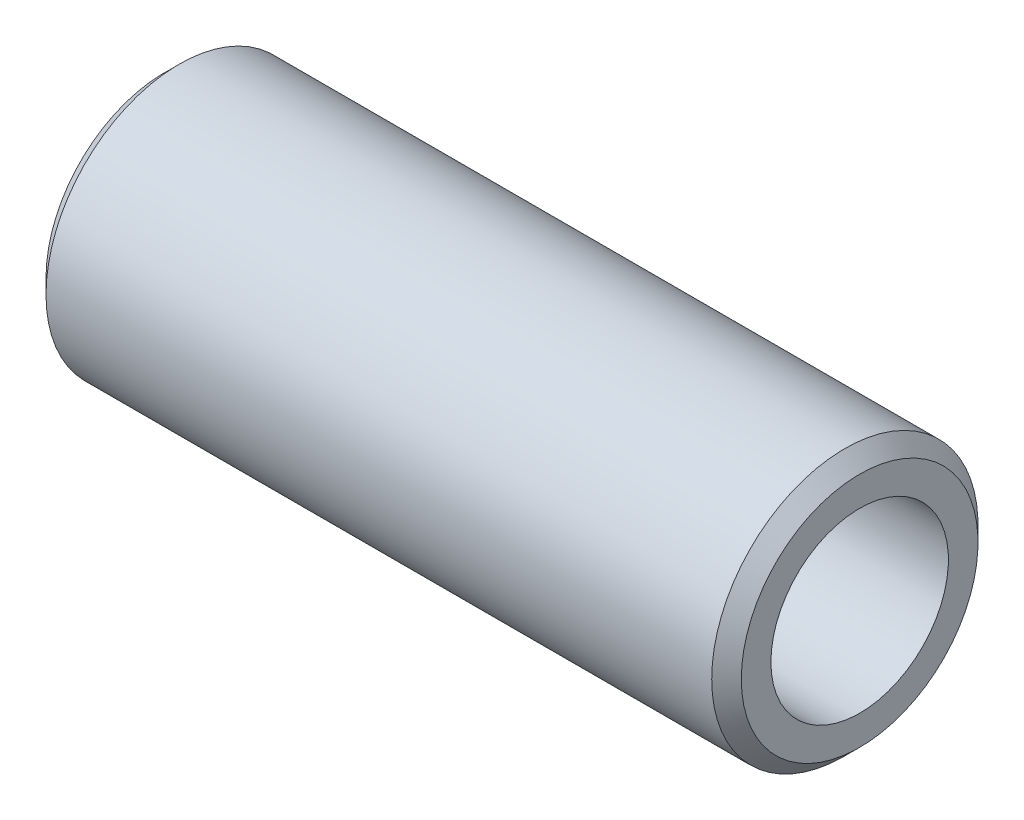
ISO-10303-21;
HEADER;
FILE_DESCRIPTION(('STEP AP214'),'2;1');
FILE_NAME('part.step','',(''),(''),'','','');
FILE_SCHEMA(('AUTOMOTIVE_DESIGN { 1 0 10303 214 1 1 1 1 }'));
ENDSEC;
DATA;
#1=APPLICATION_CONTEXT('core data for automotive mechanical design processes');
#2=APPLICATION_PROTOCOL_DEFINITION('international standard','automotive_design',2000,#1);
#3=PRODUCT_CONTEXT('',#1,'mechanical');
#4=PRODUCT('Part','Part','',(#3));
#5=PRODUCT_RELATED_PRODUCT_CATEGORY('part','',(#4));
#6=PRODUCT_DEFINITION_FORMATION('','',#4);
#7=PRODUCT_DEFINITION_CONTEXT('part definition',#1,'design');
#8=PRODUCT_DEFINITION('design','',#6,#7);
#9=PRODUCT_DEFINITION_SHAPE('','',#8);
#10=(LENGTH_UNIT() NAMED_UNIT(*) SI_UNIT(.MILLI.,.METRE.));
#11=(NAMED_UNIT(*) PLANE_ANGLE_UNIT() SI_UNIT($,.RADIAN.));
#12=(NAMED_UNIT(*) SI_UNIT($,.STERADIAN.) SOLID_ANGLE_UNIT());
#13=UNCERTAINTY_MEASURE_WITH_UNIT(LENGTH_MEASURE(1.E-05),#10,'distance_accuracy_value','');
#14=(GEOMETRIC_REPRESENTATION_CONTEXT(3) GLOBAL_UNCERTAINTY_ASSIGNED_CONTEXT((#13)) GLOBAL_UNIT_ASSIGNED_CONTEXT((#10,
#11,#12)) REPRESENTATION_CONTEXT('',''));
#15=CARTESIAN_POINT('',(0.,0.,0.));
#16=DIRECTION('',(0.,0.,1.));
#17=DIRECTION('',(1.,0.,0.));
#18=AXIS2_PLACEMENT_3D('',#15,#16,#17);
#19=CARTESIAN_POINT('',(0.5,0.,0.));
#20=DIRECTION('',(1.,0.,0.));
#21=DIRECTION('',(0.,0.,-1.));
#22=AXIS2_PLACEMENT_3D('',#19,#20,#21);
#23=CONICAL_SURFACE('',#22,4.5,0.785398163397448);
#24=CARTESIAN_POINT('',(0.,0.,0.));
#25=DIRECTION('',(-1.,0.,0.));
#26=DIRECTION('',(0.,0.,1.));
#27=AXIS2_PLACEMENT_3D('',#24,#25,#26);
#28=CIRCLE('',#27,4.);
#29=CARTESIAN_POINT('',(0.,0.,4.));
#30=VERTEX_POINT('',#29);
#31=EDGE_CURVE('E37',#30,#30,#28,.T.);
#32=ORIENTED_EDGE('',*,*,#31,.F.);
#33=EDGE_LOOP('',(#32));
#34=FACE_BOUND('',#33,.T.);
#35=CARTESIAN_POINT('',(0.5,0.,0.));
#36=DIRECTION('',(-1.,0.,0.));
#37=DIRECTION('',(0.,0.,1.));
#38=AXIS2_PLACEMENT_3D('',#35,#36,#37);
#39=CIRCLE('',#38,4.5);
#40=CARTESIAN_POINT('',(0.5,0.,4.5));
#41=VERTEX_POINT('',#40);
#42=EDGE_CURVE('E10',#41,#41,#39,.T.);
#43=ORIENTED_EDGE('',*,*,#42,.T.);
#44=EDGE_LOOP('',(#43));
#45=FACE_BOUND('',#44,.T.);
#46=ADVANCED_FACE('F15',(#34,#45),#23,.T.);
#47=CARTESIAN_POINT('',(23.5,0.,0.));
#48=DIRECTION('',(-1.,0.,0.));
#49=DIRECTION('',(0.,0.,1.));
#50=AXIS2_PLACEMENT_3D('',#47,#48,#49);
#51=CYLINDRICAL_SURFACE('',#50,4.5);
#52=ORIENTED_EDGE('',*,*,#42,.F.);
#53=EDGE_LOOP('',(#52));
#54=FACE_BOUND('',#53,.T.);
#55=CARTESIAN_POINT('',(23.,0.,0.));
#56=DIRECTION('',(-1.,0.,0.));
#57=DIRECTION('',(0.,0.,1.));
#58=AXIS2_PLACEMENT_3D('',#55,#56,#57);
#59=CIRCLE('',#58,4.5);
#60=CARTESIAN_POINT('',(23.,0.,4.5));
#61=VERTEX_POINT('',#60);
#62=EDGE_CURVE('E21',#61,#61,#59,.T.);
#63=ORIENTED_EDGE('',*,*,#62,.T.);
#64=EDGE_LOOP('',(#63));
#65=FACE_BOUND('',#64,.T.);
#66=ADVANCED_FACE('F44',(#54,#65),#51,.T.);
#67=CARTESIAN_POINT('',(23.5,0.,0.));
#68=DIRECTION('',(-1.,0.,0.));
#69=DIRECTION('',(0.,0.,1.));
#70=AXIS2_PLACEMENT_3D('',#67,#68,#69);
#71=CONICAL_SURFACE('',#70,4.,0.785398163397449);
#72=ORIENTED_EDGE('',*,*,#62,.F.);
#73=EDGE_LOOP('',(#72));
#74=FACE_BOUND('',#73,.T.);
#75=CARTESIAN_POINT('',(23.5,0.,0.));
#76=DIRECTION('',(-1.,0.,0.));
#77=DIRECTION('',(0.,0.,1.));
#78=AXIS2_PLACEMENT_3D('',#75,#76,#77);
#79=CIRCLE('',#78,4.);
#80=CARTESIAN_POINT('',(23.5,0.,4.));
#81=VERTEX_POINT('',#80);
#82=EDGE_CURVE('E25',#81,#81,#79,.T.);
#83=ORIENTED_EDGE('',*,*,#82,.T.);
#84=EDGE_LOOP('',(#83));
#85=FACE_BOUND('',#84,.T.);
#86=ADVANCED_FACE('F50',(#74,#85),#71,.T.);
#87=CARTESIAN_POINT('',(23.5,3.,0.));
#88=DIRECTION('',(-1.,0.,0.));
#89=DIRECTION('',(0.,0.,1.));
#90=AXIS2_PLACEMENT_3D('',#87,#88,#89);
#91=PLANE('',#90);
#92=ORIENTED_EDGE('',*,*,#82,.F.);
#93=EDGE_LOOP('',(#92));
#94=FACE_BOUND('',#93,.T.);
#95=CARTESIAN_POINT('',(23.5,0.,0.));
#96=DIRECTION('',(-1.,0.,0.));
#97=DIRECTION('',(0.,0.,1.));
#98=AXIS2_PLACEMENT_3D('',#95,#96,#97);
#99=CIRCLE('',#98,3.);
#100=CARTESIAN_POINT('',(23.5,0.,3.));
#101=VERTEX_POINT('',#100);
#102=EDGE_CURVE('E29',#101,#101,#99,.T.);
#103=ORIENTED_EDGE('',*,*,#102,.T.);
#104=EDGE_LOOP('',(#103));
#105=FACE_BOUND('',#104,.T.);
#106=ADVANCED_FACE('F56',(#94,#105),#91,.F.);
#107=CARTESIAN_POINT('',(23.5,0.,0.));
#108=DIRECTION('',(-1.,0.,0.));
#109=DIRECTION('',(0.,0.,1.));
#110=AXIS2_PLACEMENT_3D('',#107,#108,#109);
#111=CYLINDRICAL_SURFACE('',#110,3.);
#112=ORIENTED_EDGE('',*,*,#102,.F.);
#113=EDGE_LOOP('',(#112));
#114=FACE_BOUND('',#113,.T.);
#115=CARTESIAN_POINT('',(0.,0.,0.));
#116=DIRECTION('',(-1.,0.,0.));
#117=DIRECTION('',(0.,0.,1.));
#118=AXIS2_PLACEMENT_3D('',#115,#116,#117);
#119=CIRCLE('',#118,3.);
#120=CARTESIAN_POINT('',(0.,0.,3.));
#121=VERTEX_POINT('',#120);
#122=EDGE_CURVE('E34',#121,#121,#119,.T.);
#123=ORIENTED_EDGE('',*,*,#122,.T.);
#124=EDGE_LOOP('',(#123));
#125=FACE_BOUND('',#124,.T.);
#126=ADVANCED_FACE('F62',(#114,#125),#111,.F.);
#127=CARTESIAN_POINT('',(0.,4.,0.));
#128=DIRECTION('',(1.,0.,0.));
#129=DIRECTION('',(0.,0.,-1.));
#130=AXIS2_PLACEMENT_3D('',#127,#128,#129);
#131=PLANE('',#130);
#132=ORIENTED_EDGE('',*,*,#122,.F.);
#133=EDGE_LOOP('',(#132));
#134=FACE_BOUND('',#133,.T.);
#135=ORIENTED_EDGE('',*,*,#31,.T.);
#136=EDGE_LOOP('',(#135));
#137=FACE_BOUND('',#136,.T.);
#138=ADVANCED_FACE('F41',(#134,#137),#131,.F.);
#139=CLOSED_SHELL('',(#46,#66,#86,#106,#126,#138));
#140=MANIFOLD_SOLID_BREP('B1',#139);
#141=ADVANCED_BREP_SHAPE_REPRESENTATION('',(#18,#140),#14);
#142=SHAPE_DEFINITION_REPRESENTATION(#9,#141);
ENDSEC;
END-ISO-10303-21;
